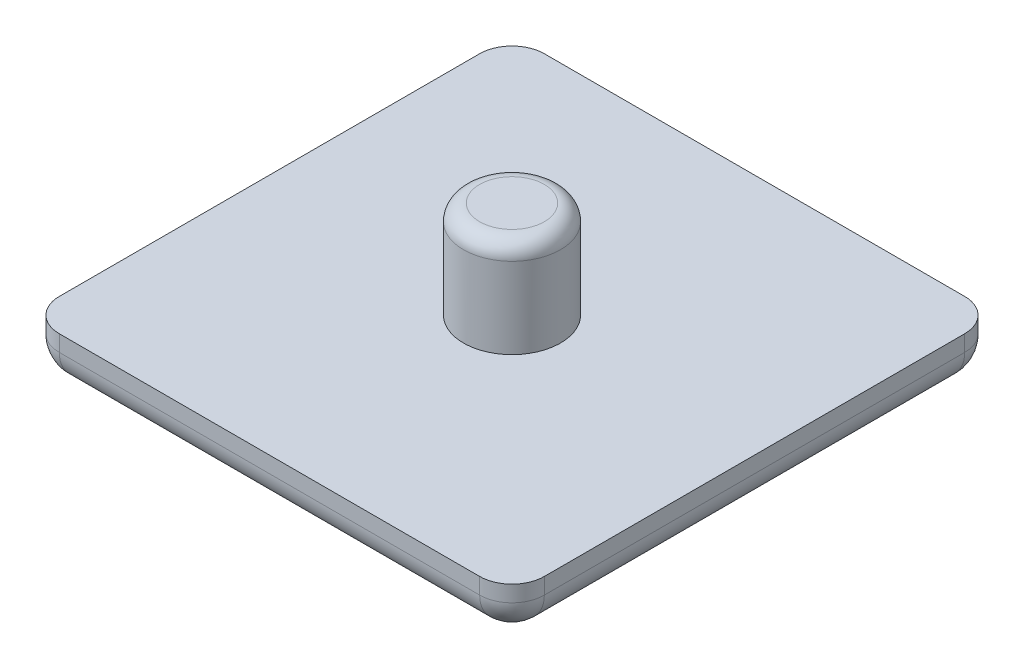
ISO-10303-21;
HEADER;
FILE_DESCRIPTION(('STEP AP214'),'2;1');
FILE_NAME('part.step','',(''),(''),'','','');
FILE_SCHEMA(('AUTOMOTIVE_DESIGN { 1 0 10303 214 1 1 1 1 }'));
ENDSEC;
DATA;
#1=APPLICATION_CONTEXT('core data for automotive mechanical design processes');
#2=APPLICATION_PROTOCOL_DEFINITION('international standard','automotive_design',2000,#1);
#3=PRODUCT_CONTEXT('',#1,'mechanical');
#4=PRODUCT('Part','Part','',(#3));
#5=PRODUCT_RELATED_PRODUCT_CATEGORY('part','',(#4));
#6=PRODUCT_DEFINITION_FORMATION('','',#4);
#7=PRODUCT_DEFINITION_CONTEXT('part definition',#1,'design');
#8=PRODUCT_DEFINITION('design','',#6,#7);
#9=PRODUCT_DEFINITION_SHAPE('','',#8);
#10=(LENGTH_UNIT() NAMED_UNIT(*) SI_UNIT(.MILLI.,.METRE.));
#11=(NAMED_UNIT(*) PLANE_ANGLE_UNIT() SI_UNIT($,.RADIAN.));
#12=(NAMED_UNIT(*) SI_UNIT($,.STERADIAN.) SOLID_ANGLE_UNIT());
#13=UNCERTAINTY_MEASURE_WITH_UNIT(LENGTH_MEASURE(1.E-05),#10,'distance_accuracy_value','');
#14=(GEOMETRIC_REPRESENTATION_CONTEXT(3) GLOBAL_UNCERTAINTY_ASSIGNED_CONTEXT((#13)) GLOBAL_UNIT_ASSIGNED_CONTEXT((#10,
#11,#12)) REPRESENTATION_CONTEXT('',''));
#15=CARTESIAN_POINT('',(0.,0.,0.));
#16=DIRECTION('',(0.,0.,1.));
#17=DIRECTION('',(1.,0.,0.));
#18=AXIS2_PLACEMENT_3D('',#15,#16,#17);
#19=CARTESIAN_POINT('',(28.,2.,-28.));
#20=DIRECTION('',(0.,0.,1.));
#21=DIRECTION('',(1.,0.,0.));
#22=AXIS2_PLACEMENT_3D('',#19,#20,#21);
#23=SPHERICAL_SURFACE('',#22,2.);
#24=CARTESIAN_POINT('',(28.,2.,-28.));
#25=DIRECTION('',(0.,1.,0.));
#26=DIRECTION('',(0.,0.,1.));
#27=AXIS2_PLACEMENT_3D('',#24,#25,#26);
#28=CIRCLE('',#27,2.);
#29=CARTESIAN_POINT('',(30.,2.,-28.));
#30=VERTEX_POINT('',#29);
#31=CARTESIAN_POINT('',(28.,2.,-30.));
#32=VERTEX_POINT('',#31);
#33=EDGE_CURVE('E11',#30,#32,#28,.T.);
#34=ORIENTED_EDGE('',*,*,#33,.F.);
#35=CARTESIAN_POINT('',(28.,2.,-28.));
#36=DIRECTION('',(0.,0.,1.));
#37=DIRECTION('',(1.,0.,0.));
#38=AXIS2_PLACEMENT_3D('',#35,#36,#37);
#39=CIRCLE('',#38,2.);
#40=CARTESIAN_POINT('',(28.,0.,-28.));
#41=VERTEX_POINT('',#40);
#42=EDGE_CURVE('E193',#41,#30,#39,.T.);
#43=ORIENTED_EDGE('',*,*,#42,.F.);
#44=CARTESIAN_POINT('',(28.,2.,-28.));
#45=DIRECTION('',(1.,0.,0.));
#46=DIRECTION('',(0.,0.,-1.));
#47=AXIS2_PLACEMENT_3D('',#44,#45,#46);
#48=CIRCLE('',#47,2.);
#49=EDGE_CURVE('E196',#32,#41,#48,.F.);
#50=ORIENTED_EDGE('',*,*,#49,.F.);
#51=EDGE_LOOP('',(#34,#43,#50));
#52=FACE_BOUND('',#51,.T.);
#53=ADVANCED_FACE('F33',(#52),#23,.T.);
#54=CARTESIAN_POINT('',(28.,3.,-28.));
#55=DIRECTION('',(0.,1.,0.));
#56=DIRECTION('',(0.,0.,1.));
#57=AXIS2_PLACEMENT_3D('',#54,#55,#56);
#58=CYLINDRICAL_SURFACE('',#57,2.);
#59=DIRECTION('',(0.,1.,0.));
#60=VECTOR('',#59,1.);
#61=CARTESIAN_POINT('',(30.,3.,-28.));
#62=LINE('',#61,#60);
#63=CARTESIAN_POINT('',(30.,3.,-28.));
#64=VERTEX_POINT('',#63);
#65=EDGE_CURVE('E198',#30,#64,#62,.T.);
#66=ORIENTED_EDGE('',*,*,#65,.F.);
#67=ORIENTED_EDGE('',*,*,#33,.T.);
#68=DIRECTION('',(0.,1.,0.));
#69=VECTOR('',#68,1.);
#70=CARTESIAN_POINT('',(28.,3.,-30.));
#71=LINE('',#70,#69);
#72=CARTESIAN_POINT('',(28.,3.,-30.));
#73=VERTEX_POINT('',#72);
#74=EDGE_CURVE('E200',#73,#32,#71,.F.);
#75=ORIENTED_EDGE('',*,*,#74,.F.);
#76=CARTESIAN_POINT('',(28.,3.,-28.));
#77=DIRECTION('',(0.,-1.,0.));
#78=DIRECTION('',(0.,0.,-1.));
#79=AXIS2_PLACEMENT_3D('',#76,#77,#78);
#80=CIRCLE('',#79,2.);
#81=EDGE_CURVE('E41',#64,#73,#80,.F.);
#82=ORIENTED_EDGE('',*,*,#81,.F.);
#83=EDGE_LOOP('',(#66,#67,#75,#82));
#84=FACE_BOUND('',#83,.T.);
#85=ADVANCED_FACE('F35',(#84),#58,.T.);
#86=CARTESIAN_POINT('',(2.,2.,-2.));
#87=DIRECTION('',(0.,0.,1.));
#88=DIRECTION('',(1.,0.,0.));
#89=AXIS2_PLACEMENT_3D('',#86,#87,#88);
#90=SPHERICAL_SURFACE('',#89,2.);
#91=CARTESIAN_POINT('',(2.,2.,-2.));
#92=DIRECTION('',(0.,1.,0.));
#93=DIRECTION('',(0.,0.,1.));
#94=AXIS2_PLACEMENT_3D('',#91,#92,#93);
#95=CIRCLE('',#94,2.);
#96=CARTESIAN_POINT('',(0.,2.,-2.));
#97=VERTEX_POINT('',#96);
#98=CARTESIAN_POINT('',(2.,2.,0.));
#99=VERTEX_POINT('',#98);
#100=EDGE_CURVE('E121',#97,#99,#95,.T.);
#101=ORIENTED_EDGE('',*,*,#100,.F.);
#102=CARTESIAN_POINT('',(2.,2.,-2.));
#103=DIRECTION('',(0.,0.,-1.));
#104=DIRECTION('',(-1.,0.,0.));
#105=AXIS2_PLACEMENT_3D('',#102,#103,#104);
#106=CIRCLE('',#105,2.);
#107=CARTESIAN_POINT('',(2.,0.,-2.));
#108=VERTEX_POINT('',#107);
#109=EDGE_CURVE('E117',#108,#97,#106,.T.);
#110=ORIENTED_EDGE('',*,*,#109,.F.);
#111=CARTESIAN_POINT('',(2.,2.,-2.));
#112=DIRECTION('',(-1.,0.,0.));
#113=DIRECTION('',(0.,0.,1.));
#114=AXIS2_PLACEMENT_3D('',#111,#112,#113);
#115=CIRCLE('',#114,2.);
#116=EDGE_CURVE('E108',#99,#108,#115,.F.);
#117=ORIENTED_EDGE('',*,*,#116,.F.);
#118=EDGE_LOOP('',(#101,#110,#117));
#119=FACE_BOUND('',#118,.T.);
#120=ADVANCED_FACE('F120',(#119),#90,.T.);
#121=CARTESIAN_POINT('',(2.,3.,-2.));
#122=DIRECTION('',(0.,1.,0.));
#123=DIRECTION('',(0.,0.,1.));
#124=AXIS2_PLACEMENT_3D('',#121,#122,#123);
#125=CYLINDRICAL_SURFACE('',#124,2.);
#126=DIRECTION('',(0.,1.,0.));
#127=VECTOR('',#126,1.);
#128=CARTESIAN_POINT('',(0.,3.,-2.));
#129=LINE('',#128,#127);
#130=CARTESIAN_POINT('',(0.,3.,-2.));
#131=VERTEX_POINT('',#130);
#132=EDGE_CURVE('E116',#97,#131,#129,.T.);
#133=ORIENTED_EDGE('',*,*,#132,.F.);
#134=ORIENTED_EDGE('',*,*,#100,.T.);
#135=DIRECTION('',(0.,1.,0.));
#136=VECTOR('',#135,1.);
#137=CARTESIAN_POINT('',(2.,3.,0.));
#138=LINE('',#137,#136);
#139=CARTESIAN_POINT('',(2.,3.,0.));
#140=VERTEX_POINT('',#139);
#141=EDGE_CURVE('E187',#140,#99,#138,.F.);
#142=ORIENTED_EDGE('',*,*,#141,.F.);
#143=CARTESIAN_POINT('',(2.,3.,-2.));
#144=DIRECTION('',(0.,-1.,0.));
#145=DIRECTION('',(0.,0.,-1.));
#146=AXIS2_PLACEMENT_3D('',#143,#144,#145);
#147=CIRCLE('',#146,2.);
#148=EDGE_CURVE('E190',#131,#140,#147,.F.);
#149=ORIENTED_EDGE('',*,*,#148,.F.);
#150=EDGE_LOOP('',(#133,#134,#142,#149));
#151=FACE_BOUND('',#150,.T.);
#152=ADVANCED_FACE('F263',(#151),#125,.T.);
#153=CARTESIAN_POINT('',(2.,2.,-28.));
#154=DIRECTION('',(0.,0.,1.));
#155=DIRECTION('',(1.,0.,0.));
#156=AXIS2_PLACEMENT_3D('',#153,#154,#155);
#157=SPHERICAL_SURFACE('',#156,2.);
#158=CARTESIAN_POINT('',(2.,2.,-28.));
#159=DIRECTION('',(0.,1.,0.));
#160=DIRECTION('',(0.,0.,1.));
#161=AXIS2_PLACEMENT_3D('',#158,#159,#160);
#162=CIRCLE('',#161,2.);
#163=CARTESIAN_POINT('',(2.,2.,-30.));
#164=VERTEX_POINT('',#163);
#165=CARTESIAN_POINT('',(0.,2.,-28.));
#166=VERTEX_POINT('',#165);
#167=EDGE_CURVE('E127',#164,#166,#162,.T.);
#168=ORIENTED_EDGE('',*,*,#167,.F.);
#169=CARTESIAN_POINT('',(2.,2.,-28.));
#170=DIRECTION('',(-1.,0.,0.));
#171=DIRECTION('',(0.,0.,1.));
#172=AXIS2_PLACEMENT_3D('',#169,#170,#171);
#173=CIRCLE('',#172,2.);
#174=CARTESIAN_POINT('',(2.,0.,-28.));
#175=VERTEX_POINT('',#174);
#176=EDGE_CURVE('E182',#164,#175,#173,.T.);
#177=ORIENTED_EDGE('',*,*,#176,.T.);
#178=CARTESIAN_POINT('',(2.,2.,-28.));
#179=DIRECTION('',(0.,0.,-1.));
#180=DIRECTION('',(-1.,0.,0.));
#181=AXIS2_PLACEMENT_3D('',#178,#179,#180);
#182=CIRCLE('',#181,2.);
#183=EDGE_CURVE('E143',#166,#175,#182,.F.);
#184=ORIENTED_EDGE('',*,*,#183,.F.);
#185=EDGE_LOOP('',(#168,#177,#184));
#186=FACE_BOUND('',#185,.T.);
#187=ADVANCED_FACE('F266',(#186),#157,.T.);
#188=CARTESIAN_POINT('',(0.,2.,-28.));
#189=DIRECTION('',(1.,0.,0.));
#190=DIRECTION('',(0.,0.,-1.));
#191=AXIS2_PLACEMENT_3D('',#188,#189,#190);
#192=CYLINDRICAL_SURFACE('',#191,2.);
#193=DIRECTION('',(-1.,0.,0.));
#194=VECTOR('',#193,1.);
#195=CARTESIAN_POINT('',(0.,2.,-30.));
#196=LINE('',#195,#194);
#197=EDGE_CURVE('E171',#32,#164,#196,.T.);
#198=ORIENTED_EDGE('',*,*,#197,.F.);
#199=ORIENTED_EDGE('',*,*,#49,.T.);
#200=DIRECTION('',(-1.,0.,0.));
#201=VECTOR('',#200,1.);
#202=CARTESIAN_POINT('',(0.,0.,-28.));
#203=LINE('',#202,#201);
#204=EDGE_CURVE('E165',#175,#41,#203,.F.);
#205=ORIENTED_EDGE('',*,*,#204,.F.);
#206=ORIENTED_EDGE('',*,*,#176,.F.);
#207=EDGE_LOOP('',(#198,#199,#205,#206));
#208=FACE_BOUND('',#207,.T.);
#209=ADVANCED_FACE('F213',(#208),#192,.T.);
#210=CARTESIAN_POINT('',(28.,2.,0.));
#211=DIRECTION('',(0.,0.,1.));
#212=DIRECTION('',(1.,0.,0.));
#213=AXIS2_PLACEMENT_3D('',#210,#211,#212);
#214=CYLINDRICAL_SURFACE('',#213,2.);
#215=DIRECTION('',(0.,0.,-1.));
#216=VECTOR('',#215,1.);
#217=CARTESIAN_POINT('',(28.,0.,0.));
#218=LINE('',#217,#216);
#219=CARTESIAN_POINT('',(28.,0.,-2.));
#220=VERTEX_POINT('',#219);
#221=EDGE_CURVE('E136',#41,#220,#218,.F.);
#222=ORIENTED_EDGE('',*,*,#221,.F.);
#223=ORIENTED_EDGE('',*,*,#42,.T.);
#224=DIRECTION('',(0.,0.,-1.));
#225=VECTOR('',#224,1.);
#226=CARTESIAN_POINT('',(30.,2.,0.));
#227=LINE('',#226,#225);
#228=CARTESIAN_POINT('',(30.,2.,-2.));
#229=VERTEX_POINT('',#228);
#230=EDGE_CURVE('E146',#229,#30,#227,.T.);
#231=ORIENTED_EDGE('',*,*,#230,.F.);
#232=CARTESIAN_POINT('',(28.,2.,-2.));
#233=DIRECTION('',(0.,0.,-1.));
#234=DIRECTION('',(-1.,0.,0.));
#235=AXIS2_PLACEMENT_3D('',#232,#233,#234);
#236=CIRCLE('',#235,2.);
#237=EDGE_CURVE('E180',#229,#220,#236,.T.);
#238=ORIENTED_EDGE('',*,*,#237,.T.);
#239=EDGE_LOOP('',(#222,#223,#231,#238));
#240=FACE_BOUND('',#239,.T.);
#241=ADVANCED_FACE('F277',(#240),#214,.T.);
#242=CARTESIAN_POINT('',(28.,2.,-2.));
#243=DIRECTION('',(0.,0.,1.));
#244=DIRECTION('',(1.,0.,0.));
#245=AXIS2_PLACEMENT_3D('',#242,#243,#244);
#246=SPHERICAL_SURFACE('',#245,2.);
#247=ORIENTED_EDGE('',*,*,#237,.F.);
#248=CARTESIAN_POINT('',(28.,2.,-2.));
#249=DIRECTION('',(0.,-1.,0.));
#250=DIRECTION('',(0.,0.,-1.));
#251=AXIS2_PLACEMENT_3D('',#248,#249,#250);
#252=CIRCLE('',#251,2.);
#253=CARTESIAN_POINT('',(28.,2.,0.));
#254=VERTEX_POINT('',#253);
#255=EDGE_CURVE('E177',#229,#254,#252,.T.);
#256=ORIENTED_EDGE('',*,*,#255,.T.);
#257=CARTESIAN_POINT('',(28.,2.,-2.));
#258=DIRECTION('',(-1.,0.,0.));
#259=DIRECTION('',(0.,0.,1.));
#260=AXIS2_PLACEMENT_3D('',#257,#258,#259);
#261=CIRCLE('',#260,2.);
#262=EDGE_CURVE('E163',#220,#254,#261,.T.);
#263=ORIENTED_EDGE('',*,*,#262,.F.);
#264=EDGE_LOOP('',(#247,#256,#263));
#265=FACE_BOUND('',#264,.T.);
#266=ADVANCED_FACE('F280',(#265),#246,.T.);
#267=CARTESIAN_POINT('',(28.,3.,-2.));
#268=DIRECTION('',(0.,-1.,0.));
#269=DIRECTION('',(0.,0.,-1.));
#270=AXIS2_PLACEMENT_3D('',#267,#268,#269);
#271=CYLINDRICAL_SURFACE('',#270,2.);
#272=ORIENTED_EDGE('',*,*,#255,.F.);
#273=DIRECTION('',(0.,-1.,0.));
#274=VECTOR('',#273,1.);
#275=CARTESIAN_POINT('',(30.,3.,-2.));
#276=LINE('',#275,#274);
#277=CARTESIAN_POINT('',(30.,3.,-2.));
#278=VERTEX_POINT('',#277);
#279=EDGE_CURVE('E152',#278,#229,#276,.T.);
#280=ORIENTED_EDGE('',*,*,#279,.F.);
#281=CARTESIAN_POINT('',(28.,3.,-2.));
#282=DIRECTION('',(0.,-1.,0.));
#283=DIRECTION('',(0.,0.,-1.));
#284=AXIS2_PLACEMENT_3D('',#281,#282,#283);
#285=CIRCLE('',#284,2.);
#286=CARTESIAN_POINT('',(28.,3.,0.));
#287=VERTEX_POINT('',#286);
#288=EDGE_CURVE('E161',#287,#278,#285,.F.);
#289=ORIENTED_EDGE('',*,*,#288,.F.);
#290=DIRECTION('',(0.,-1.,0.));
#291=VECTOR('',#290,1.);
#292=CARTESIAN_POINT('',(28.,3.,0.));
#293=LINE('',#292,#291);
#294=EDGE_CURVE('E155',#254,#287,#293,.F.);
#295=ORIENTED_EDGE('',*,*,#294,.F.);
#296=EDGE_LOOP('',(#272,#280,#289,#295));
#297=FACE_BOUND('',#296,.T.);
#298=ADVANCED_FACE('F272',(#297),#271,.T.);
#299=CARTESIAN_POINT('',(2.,3.,-28.));
#300=DIRECTION('',(0.,1.,0.));
#301=DIRECTION('',(0.,0.,1.));
#302=AXIS2_PLACEMENT_3D('',#299,#300,#301);
#303=CYLINDRICAL_SURFACE('',#302,2.);
#304=DIRECTION('',(0.,1.,0.));
#305=VECTOR('',#304,1.);
#306=CARTESIAN_POINT('',(2.,3.,-30.));
#307=LINE('',#306,#305);
#308=CARTESIAN_POINT('',(2.,3.,-30.));
#309=VERTEX_POINT('',#308);
#310=EDGE_CURVE('E168',#164,#309,#307,.T.);
#311=ORIENTED_EDGE('',*,*,#310,.F.);
#312=ORIENTED_EDGE('',*,*,#167,.T.);
#313=DIRECTION('',(0.,1.,0.));
#314=VECTOR('',#313,1.);
#315=CARTESIAN_POINT('',(0.,3.,-28.));
#316=LINE('',#315,#314);
#317=CARTESIAN_POINT('',(0.,3.,-28.));
#318=VERTEX_POINT('',#317);
#319=EDGE_CURVE('E174',#318,#166,#316,.F.);
#320=ORIENTED_EDGE('',*,*,#319,.F.);
#321=CARTESIAN_POINT('',(2.,3.,-28.));
#322=DIRECTION('',(0.,-1.,0.));
#323=DIRECTION('',(0.,0.,-1.));
#324=AXIS2_PLACEMENT_3D('',#321,#322,#323);
#325=CIRCLE('',#324,2.);
#326=EDGE_CURVE('E158',#309,#318,#325,.F.);
#327=ORIENTED_EDGE('',*,*,#326,.F.);
#328=EDGE_LOOP('',(#311,#312,#320,#327));
#329=FACE_BOUND('',#328,.T.);
#330=ADVANCED_FACE('F218',(#329),#303,.T.);
#331=CARTESIAN_POINT('',(2.,2.,0.));
#332=DIRECTION('',(0.,0.,-1.));
#333=DIRECTION('',(-1.,0.,0.));
#334=AXIS2_PLACEMENT_3D('',#331,#332,#333);
#335=CYLINDRICAL_SURFACE('',#334,2.);
#336=DIRECTION('',(0.,0.,1.));
#337=VECTOR('',#336,1.);
#338=CARTESIAN_POINT('',(2.,0.,0.));
#339=LINE('',#338,#337);
#340=EDGE_CURVE('E134',#108,#175,#339,.F.);
#341=ORIENTED_EDGE('',*,*,#340,.F.);
#342=ORIENTED_EDGE('',*,*,#109,.T.);
#343=DIRECTION('',(0.,0.,1.));
#344=VECTOR('',#343,1.);
#345=CARTESIAN_POINT('',(0.,2.,0.));
#346=LINE('',#345,#344);
#347=EDGE_CURVE('E138',#166,#97,#346,.T.);
#348=ORIENTED_EDGE('',*,*,#347,.F.);
#349=ORIENTED_EDGE('',*,*,#183,.T.);
#350=EDGE_LOOP('',(#341,#342,#348,#349));
#351=FACE_BOUND('',#350,.T.);
#352=ADVANCED_FACE('F141',(#351),#335,.T.);
#353=CARTESIAN_POINT('',(0.,2.,-2.));
#354=DIRECTION('',(-1.,0.,0.));
#355=DIRECTION('',(0.,0.,1.));
#356=AXIS2_PLACEMENT_3D('',#353,#354,#355);
#357=CYLINDRICAL_SURFACE('',#356,2.);
#358=DIRECTION('',(1.,0.,0.));
#359=VECTOR('',#358,1.);
#360=CARTESIAN_POINT('',(0.,2.,0.));
#361=LINE('',#360,#359);
#362=EDGE_CURVE('E114',#99,#254,#361,.T.);
#363=ORIENTED_EDGE('',*,*,#362,.F.);
#364=ORIENTED_EDGE('',*,*,#116,.T.);
#365=DIRECTION('',(1.,0.,0.));
#366=VECTOR('',#365,1.);
#367=CARTESIAN_POINT('',(0.,0.,-2.));
#368=LINE('',#367,#366);
#369=EDGE_CURVE('E113',#220,#108,#368,.F.);
#370=ORIENTED_EDGE('',*,*,#369,.F.);
#371=ORIENTED_EDGE('',*,*,#262,.T.);
#372=EDGE_LOOP('',(#363,#364,#370,#371));
#373=FACE_BOUND('',#372,.T.);
#374=ADVANCED_FACE('F110',(#373),#357,.T.);
#375=CARTESIAN_POINT('',(15.,8.,-15.));
#376=DIRECTION('',(0.,1.,0.));
#377=DIRECTION('',(0.,0.,1.));
#378=AXIS2_PLACEMENT_3D('',#375,#376,#377);
#379=TOROIDAL_SURFACE('',#378,2.,1.);
#380=CARTESIAN_POINT('',(15.,9.,-15.));
#381=DIRECTION('',(0.,1.,0.));
#382=DIRECTION('',(0.,0.,1.));
#383=AXIS2_PLACEMENT_3D('',#380,#381,#382);
#384=CIRCLE('',#383,2.);
#385=CARTESIAN_POINT('',(15.,9.,-13.));
#386=VERTEX_POINT('',#385);
#387=EDGE_CURVE('E235',#386,#386,#384,.T.);
#388=ORIENTED_EDGE('',*,*,#387,.F.);
#389=EDGE_LOOP('',(#388));
#390=FACE_BOUND('',#389,.T.);
#391=CARTESIAN_POINT('',(15.,8.,-15.));
#392=DIRECTION('',(0.,1.,0.));
#393=DIRECTION('',(0.,0.,1.));
#394=AXIS2_PLACEMENT_3D('',#391,#392,#393);
#395=CIRCLE('',#394,3.);
#396=CARTESIAN_POINT('',(15.,8.,-12.));
#397=VERTEX_POINT('',#396);
#398=EDGE_CURVE('E238',#397,#397,#395,.F.);
#399=ORIENTED_EDGE('',*,*,#398,.F.);
#400=EDGE_LOOP('',(#399));
#401=FACE_BOUND('',#400,.T.);
#402=ADVANCED_FACE('F245',(#390,#401),#379,.T.);
#403=CARTESIAN_POINT('',(0.,3.,0.));
#404=DIRECTION('',(1.,0.,0.));
#405=DIRECTION('',(0.,0.,-1.));
#406=AXIS2_PLACEMENT_3D('',#403,#404,#405);
#407=PLANE('',#406);
#408=ORIENTED_EDGE('',*,*,#347,.T.);
#409=ORIENTED_EDGE('',*,*,#132,.T.);
#410=DIRECTION('',(0.,0.,1.));
#411=VECTOR('',#410,1.);
#412=CARTESIAN_POINT('',(0.,3.,0.));
#413=LINE('',#412,#411);
#414=EDGE_CURVE('E222',#318,#131,#413,.T.);
#415=ORIENTED_EDGE('',*,*,#414,.F.);
#416=ORIENTED_EDGE('',*,*,#319,.T.);
#417=EDGE_LOOP('',(#408,#409,#415,#416));
#418=FACE_BOUND('',#417,.T.);
#419=ADVANCED_FACE('F224',(#418),#407,.F.);
#420=CARTESIAN_POINT('',(0.,3.,0.));
#421=DIRECTION('',(0.,0.,-1.));
#422=DIRECTION('',(-1.,0.,0.));
#423=AXIS2_PLACEMENT_3D('',#420,#421,#422);
#424=PLANE('',#423);
#425=DIRECTION('',(1.,0.,0.));
#426=VECTOR('',#425,1.);
#427=CARTESIAN_POINT('',(0.,3.,0.));
#428=LINE('',#427,#426);
#429=EDGE_CURVE('E225',#140,#287,#428,.T.);
#430=ORIENTED_EDGE('',*,*,#429,.F.);
#431=ORIENTED_EDGE('',*,*,#141,.T.);
#432=ORIENTED_EDGE('',*,*,#362,.T.);
#433=ORIENTED_EDGE('',*,*,#294,.T.);
#434=EDGE_LOOP('',(#430,#431,#432,#433));
#435=FACE_BOUND('',#434,.T.);
#436=ADVANCED_FACE('F253',(#435),#424,.F.);
#437=CARTESIAN_POINT('',(30.,3.,0.));
#438=DIRECTION('',(-1.,0.,0.));
#439=DIRECTION('',(0.,0.,1.));
#440=AXIS2_PLACEMENT_3D('',#437,#438,#439);
#441=PLANE('',#440);
#442=ORIENTED_EDGE('',*,*,#230,.T.);
#443=ORIENTED_EDGE('',*,*,#65,.T.);
#444=DIRECTION('',(0.,0.,-1.));
#445=VECTOR('',#444,1.);
#446=CARTESIAN_POINT('',(30.,3.,0.));
#447=LINE('',#446,#445);
#448=EDGE_CURVE('E227',#278,#64,#447,.T.);
#449=ORIENTED_EDGE('',*,*,#448,.F.);
#450=ORIENTED_EDGE('',*,*,#279,.T.);
#451=EDGE_LOOP('',(#442,#443,#449,#450));
#452=FACE_BOUND('',#451,.T.);
#453=ADVANCED_FACE('F312',(#452),#441,.F.);
#454=CARTESIAN_POINT('',(0.,3.,-30.));
#455=DIRECTION('',(0.,0.,1.));
#456=DIRECTION('',(1.,0.,0.));
#457=AXIS2_PLACEMENT_3D('',#454,#455,#456);
#458=PLANE('',#457);
#459=DIRECTION('',(-1.,0.,0.));
#460=VECTOR('',#459,1.);
#461=CARTESIAN_POINT('',(0.,3.,-30.));
#462=LINE('',#461,#460);
#463=EDGE_CURVE('E208',#73,#309,#462,.T.);
#464=ORIENTED_EDGE('',*,*,#463,.F.);
#465=ORIENTED_EDGE('',*,*,#74,.T.);
#466=ORIENTED_EDGE('',*,*,#197,.T.);
#467=ORIENTED_EDGE('',*,*,#310,.T.);
#468=EDGE_LOOP('',(#464,#465,#466,#467));
#469=FACE_BOUND('',#468,.T.);
#470=ADVANCED_FACE('F205',(#469),#458,.F.);
#471=CARTESIAN_POINT('',(0.,3.,0.));
#472=DIRECTION('',(0.,-1.,0.));
#473=DIRECTION('',(0.,0.,-1.));
#474=AXIS2_PLACEMENT_3D('',#471,#472,#473);
#475=PLANE('',#474);
#476=CARTESIAN_POINT('',(15.,3.,-15.));
#477=DIRECTION('',(0.,-1.,0.));
#478=DIRECTION('',(0.,0.,-1.));
#479=AXIS2_PLACEMENT_3D('',#476,#477,#478);
#480=CIRCLE('',#479,3.);
#481=CARTESIAN_POINT('',(15.,3.,-18.));
#482=VERTEX_POINT('',#481);
#483=EDGE_CURVE('E232',#482,#482,#480,.F.);
#484=ORIENTED_EDGE('',*,*,#483,.F.);
#485=EDGE_LOOP('',(#484));
#486=FACE_BOUND('',#485,.T.);
#487=ORIENTED_EDGE('',*,*,#448,.T.);
#488=ORIENTED_EDGE('',*,*,#81,.T.);
#489=ORIENTED_EDGE('',*,*,#463,.T.);
#490=ORIENTED_EDGE('',*,*,#326,.T.);
#491=ORIENTED_EDGE('',*,*,#414,.T.);
#492=ORIENTED_EDGE('',*,*,#148,.T.);
#493=ORIENTED_EDGE('',*,*,#429,.T.);
#494=ORIENTED_EDGE('',*,*,#288,.T.);
#495=EDGE_LOOP('',(#487,#488,#489,#490,#491,#492,#493,#494));
#496=FACE_BOUND('',#495,.T.);
#497=ADVANCED_FACE('F221',(#486,#496),#475,.F.);
#498=CARTESIAN_POINT('',(0.,0.,0.));
#499=DIRECTION('',(0.,-1.,0.));
#500=DIRECTION('',(0.,0.,-1.));
#501=AXIS2_PLACEMENT_3D('',#498,#499,#500);
#502=PLANE('',#501);
#503=ORIENTED_EDGE('',*,*,#204,.T.);
#504=ORIENTED_EDGE('',*,*,#221,.T.);
#505=ORIENTED_EDGE('',*,*,#369,.T.);
#506=ORIENTED_EDGE('',*,*,#340,.T.);
#507=EDGE_LOOP('',(#503,#504,#505,#506));
#508=FACE_BOUND('',#507,.T.);
#509=ADVANCED_FACE('F133',(#508),#502,.T.);
#510=CARTESIAN_POINT('',(15.,9.,-15.));
#511=DIRECTION('',(0.,-1.,0.));
#512=DIRECTION('',(0.,0.,-1.));
#513=AXIS2_PLACEMENT_3D('',#510,#511,#512);
#514=CYLINDRICAL_SURFACE('',#513,3.);
#515=ORIENTED_EDGE('',*,*,#398,.T.);
#516=EDGE_LOOP('',(#515));
#517=FACE_BOUND('',#516,.T.);
#518=ORIENTED_EDGE('',*,*,#483,.T.);
#519=EDGE_LOOP('',(#518));
#520=FACE_BOUND('',#519,.T.);
#521=ADVANCED_FACE('F242',(#517,#520),#514,.T.);
#522=CARTESIAN_POINT('',(15.,9.,-15.));
#523=DIRECTION('',(0.,1.,0.));
#524=DIRECTION('',(0.,0.,1.));
#525=AXIS2_PLACEMENT_3D('',#522,#523,#524);
#526=PLANE('',#525);
#527=ORIENTED_EDGE('',*,*,#387,.T.);
#528=EDGE_LOOP('',(#527));
#529=FACE_BOUND('',#528,.T.);
#530=ADVANCED_FACE('F379',(#529),#526,.T.);
#531=CLOSED_SHELL('',(#53,#85,#120,#152,#187,#209,#241,#266,#298,#330,#352,#374,#402,#419,#436,
#453,#470,#497,#509,#521,#530));
#532=MANIFOLD_SOLID_BREP('B2',#531);
#533=ADVANCED_BREP_SHAPE_REPRESENTATION('',(#18,#532),#14);
#534=SHAPE_DEFINITION_REPRESENTATION(#9,#533);
ENDSEC;
END-ISO-10303-21;
